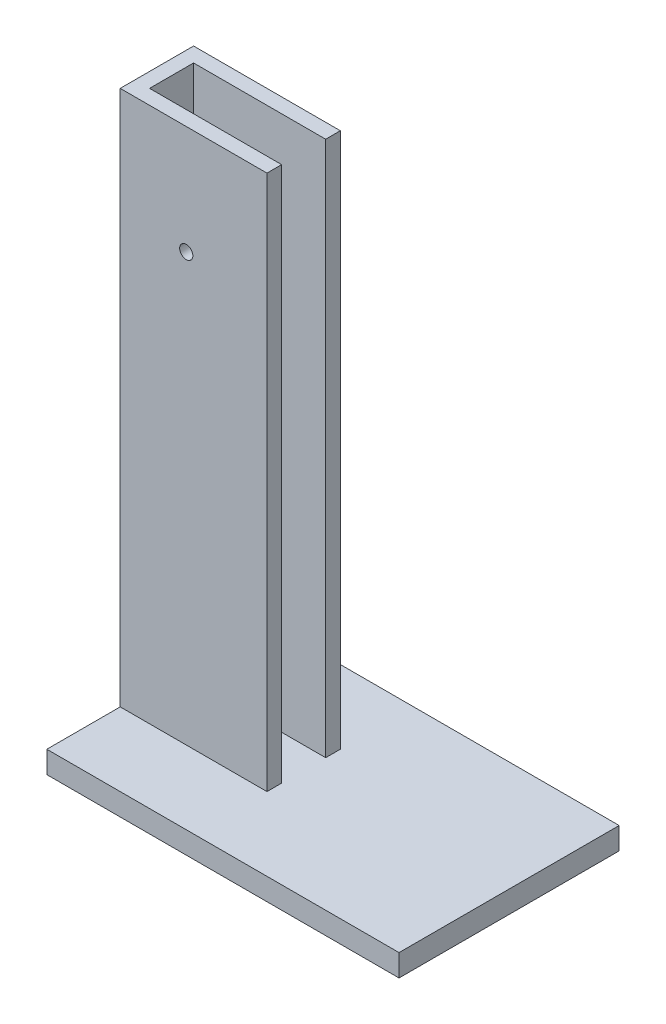
ISO-10303-21;
HEADER;
FILE_DESCRIPTION(('STEP AP214'),'2;1');
FILE_NAME('part.step','',(''),(''),'','','');
FILE_SCHEMA(('AUTOMOTIVE_DESIGN { 1 0 10303 214 1 1 1 1 }'));
ENDSEC;
DATA;
#1=APPLICATION_CONTEXT('core data for automotive mechanical design processes');
#2=APPLICATION_PROTOCOL_DEFINITION('international standard','automotive_design',2000,#1);
#3=PRODUCT_CONTEXT('',#1,'mechanical');
#4=PRODUCT('Part','Part','',(#3));
#5=PRODUCT_RELATED_PRODUCT_CATEGORY('part','',(#4));
#6=PRODUCT_DEFINITION_FORMATION('','',#4);
#7=PRODUCT_DEFINITION_CONTEXT('part definition',#1,'design');
#8=PRODUCT_DEFINITION('design','',#6,#7);
#9=PRODUCT_DEFINITION_SHAPE('','',#8);
#10=(LENGTH_UNIT() NAMED_UNIT(*) SI_UNIT(.MILLI.,.METRE.));
#11=(NAMED_UNIT(*) PLANE_ANGLE_UNIT() SI_UNIT($,.RADIAN.));
#12=(NAMED_UNIT(*) SI_UNIT($,.STERADIAN.) SOLID_ANGLE_UNIT());
#13=UNCERTAINTY_MEASURE_WITH_UNIT(LENGTH_MEASURE(1.E-05),#10,'distance_accuracy_value','');
#14=(GEOMETRIC_REPRESENTATION_CONTEXT(3) GLOBAL_UNCERTAINTY_ASSIGNED_CONTEXT((#13)) GLOBAL_UNIT_ASSIGNED_CONTEXT((#10,
#11,#12)) REPRESENTATION_CONTEXT('',''));
#15=CARTESIAN_POINT('',(0.,0.,0.));
#16=DIRECTION('',(0.,0.,1.));
#17=DIRECTION('',(1.,0.,0.));
#18=AXIS2_PLACEMENT_3D('',#15,#16,#17);
#19=CARTESIAN_POINT('',(380.,-30.,-150.));
#20=DIRECTION('',(-1.,0.,0.));
#21=DIRECTION('',(0.,0.,1.));
#22=AXIS2_PLACEMENT_3D('',#19,#20,#21);
#23=PLANE('',#22);
#24=DIRECTION('',(0.,0.,1.));
#25=VECTOR('',#24,1.);
#26=CARTESIAN_POINT('',(380.,0.,-150.));
#27=LINE('',#26,#25);
#28=CARTESIAN_POINT('',(380.,0.,-150.));
#29=VERTEX_POINT('',#28);
#30=CARTESIAN_POINT('',(380.,0.,150.));
#31=VERTEX_POINT('',#30);
#32=EDGE_CURVE('E120',#29,#31,#27,.T.);
#33=ORIENTED_EDGE('',*,*,#32,.T.);
#34=DIRECTION('',(0.,1.,0.));
#35=VECTOR('',#34,1.);
#36=CARTESIAN_POINT('',(380.,-30.,150.));
#37=LINE('',#36,#35);
#38=CARTESIAN_POINT('',(380.,-30.,150.));
#39=VERTEX_POINT('',#38);
#40=EDGE_CURVE('E12',#39,#31,#37,.T.);
#41=ORIENTED_EDGE('',*,*,#40,.F.);
#42=DIRECTION('',(0.,0.,1.));
#43=VECTOR('',#42,1.);
#44=CARTESIAN_POINT('',(380.,-30.,-150.));
#45=LINE('',#44,#43);
#46=CARTESIAN_POINT('',(380.,-30.,-150.));
#47=VERTEX_POINT('',#46);
#48=EDGE_CURVE('E108',#47,#39,#45,.T.);
#49=ORIENTED_EDGE('',*,*,#48,.F.);
#50=DIRECTION('',(0.,1.,0.));
#51=VECTOR('',#50,1.);
#52=CARTESIAN_POINT('',(380.,-30.,-150.));
#53=LINE('',#52,#51);
#54=EDGE_CURVE('E116',#47,#29,#53,.T.);
#55=ORIENTED_EDGE('',*,*,#54,.T.);
#56=EDGE_LOOP('',(#33,#41,#49,#55));
#57=FACE_BOUND('',#56,.T.);
#58=ADVANCED_FACE('F57',(#57),#23,.F.);
#59=CARTESIAN_POINT('',(-100.,-30.,150.));
#60=DIRECTION('',(0.,0.,-1.));
#61=DIRECTION('',(-1.,0.,0.));
#62=AXIS2_PLACEMENT_3D('',#59,#60,#61);
#63=PLANE('',#62);
#64=DIRECTION('',(-1.,0.,0.));
#65=VECTOR('',#64,1.);
#66=CARTESIAN_POINT('',(-100.,0.,150.));
#67=LINE('',#66,#65);
#68=CARTESIAN_POINT('',(-100.,0.,150.));
#69=VERTEX_POINT('',#68);
#70=EDGE_CURVE('E112',#31,#69,#67,.T.);
#71=ORIENTED_EDGE('',*,*,#70,.T.);
#72=DIRECTION('',(0.,1.,0.));
#73=VECTOR('',#72,1.);
#74=CARTESIAN_POINT('',(-100.,-30.,150.));
#75=LINE('',#74,#73);
#76=CARTESIAN_POINT('',(-100.,-30.,150.));
#77=VERTEX_POINT('',#76);
#78=EDGE_CURVE('E65',#77,#69,#75,.T.);
#79=ORIENTED_EDGE('',*,*,#78,.F.);
#80=DIRECTION('',(-1.,0.,0.));
#81=VECTOR('',#80,1.);
#82=CARTESIAN_POINT('',(-100.,-30.,150.));
#83=LINE('',#82,#81);
#84=EDGE_CURVE('E103',#39,#77,#83,.T.);
#85=ORIENTED_EDGE('',*,*,#84,.F.);
#86=ORIENTED_EDGE('',*,*,#40,.T.);
#87=EDGE_LOOP('',(#71,#79,#85,#86));
#88=FACE_BOUND('',#87,.T.);
#89=ADVANCED_FACE('F111',(#88),#63,.F.);
#90=CARTESIAN_POINT('',(-100.,-30.,-150.));
#91=DIRECTION('',(1.,0.,0.));
#92=DIRECTION('',(0.,0.,-1.));
#93=AXIS2_PLACEMENT_3D('',#90,#91,#92);
#94=PLANE('',#93);
#95=DIRECTION('',(0.,0.,-1.));
#96=VECTOR('',#95,1.);
#97=CARTESIAN_POINT('',(-100.,0.,-150.));
#98=LINE('',#97,#96);
#99=CARTESIAN_POINT('',(-100.,0.,-150.));
#100=VERTEX_POINT('',#99);
#101=EDGE_CURVE('E90',#69,#100,#98,.T.);
#102=ORIENTED_EDGE('',*,*,#101,.T.);
#103=DIRECTION('',(0.,1.,0.));
#104=VECTOR('',#103,1.);
#105=CARTESIAN_POINT('',(-100.,-30.,-150.));
#106=LINE('',#105,#104);
#107=CARTESIAN_POINT('',(-100.,-30.,-150.));
#108=VERTEX_POINT('',#107);
#109=EDGE_CURVE('E113',#108,#100,#106,.T.);
#110=ORIENTED_EDGE('',*,*,#109,.F.);
#111=DIRECTION('',(0.,0.,-1.));
#112=VECTOR('',#111,1.);
#113=CARTESIAN_POINT('',(-100.,-30.,-150.));
#114=LINE('',#113,#112);
#115=EDGE_CURVE('E106',#77,#108,#114,.T.);
#116=ORIENTED_EDGE('',*,*,#115,.F.);
#117=ORIENTED_EDGE('',*,*,#78,.T.);
#118=EDGE_LOOP('',(#102,#110,#116,#117));
#119=FACE_BOUND('',#118,.T.);
#120=ADVANCED_FACE('F114',(#119),#94,.F.);
#121=CARTESIAN_POINT('',(-100.,-30.,-150.));
#122=DIRECTION('',(0.,0.,1.));
#123=DIRECTION('',(1.,0.,0.));
#124=AXIS2_PLACEMENT_3D('',#121,#122,#123);
#125=PLANE('',#124);
#126=DIRECTION('',(1.,0.,0.));
#127=VECTOR('',#126,1.);
#128=CARTESIAN_POINT('',(-100.,0.,-150.));
#129=LINE('',#128,#127);
#130=EDGE_CURVE('E96',#100,#29,#129,.T.);
#131=ORIENTED_EDGE('',*,*,#130,.T.);
#132=ORIENTED_EDGE('',*,*,#54,.F.);
#133=DIRECTION('',(1.,0.,0.));
#134=VECTOR('',#133,1.);
#135=CARTESIAN_POINT('',(-100.,-30.,-150.));
#136=LINE('',#135,#134);
#137=EDGE_CURVE('E73',#108,#47,#136,.T.);
#138=ORIENTED_EDGE('',*,*,#137,.F.);
#139=ORIENTED_EDGE('',*,*,#109,.T.);
#140=EDGE_LOOP('',(#131,#132,#138,#139));
#141=FACE_BOUND('',#140,.T.);
#142=ADVANCED_FACE('F127',(#141),#125,.F.);
#143=CARTESIAN_POINT('',(0.,-30.,0.));
#144=DIRECTION('',(0.,1.,0.));
#145=DIRECTION('',(0.,0.,1.));
#146=AXIS2_PLACEMENT_3D('',#143,#144,#145);
#147=PLANE('',#146);
#148=ORIENTED_EDGE('',*,*,#48,.T.);
#149=ORIENTED_EDGE('',*,*,#84,.T.);
#150=ORIENTED_EDGE('',*,*,#115,.T.);
#151=ORIENTED_EDGE('',*,*,#137,.T.);
#152=EDGE_LOOP('',(#148,#149,#150,#151));
#153=FACE_BOUND('',#152,.T.);
#154=ADVANCED_FACE('F104',(#153),#147,.F.);
#155=CARTESIAN_POINT('',(0.,0.,0.));
#156=DIRECTION('',(0.,1.,0.));
#157=DIRECTION('',(0.,0.,1.));
#158=AXIS2_PLACEMENT_3D('',#155,#156,#157);
#159=PLANE('',#158);
#160=ORIENTED_EDGE('',*,*,#32,.F.);
#161=ORIENTED_EDGE('',*,*,#130,.F.);
#162=ORIENTED_EDGE('',*,*,#101,.F.);
#163=ORIENTED_EDGE('',*,*,#70,.F.);
#164=EDGE_LOOP('',(#160,#161,#162,#163));
#165=FACE_BOUND('',#164,.T.);
#166=ADVANCED_FACE('F130',(#165),#159,.T.);
#167=CLOSED_SHELL('',(#58,#89,#120,#142,#154,#166));
#168=MANIFOLD_SOLID_BREP('B2',#167);
#169=CARTESIAN_POINT('',(100.,730.,-50.));
#170=DIRECTION('',(-1.,0.,0.));
#171=DIRECTION('',(0.,0.,1.));
#172=AXIS2_PLACEMENT_3D('',#169,#170,#171);
#173=PLANE('',#172);
#174=DIRECTION('',(0.,0.,-1.));
#175=VECTOR('',#174,1.);
#176=CARTESIAN_POINT('',(100.,0.,-50.));
#177=LINE('',#176,#175);
#178=CARTESIAN_POINT('',(100.,0.,-30.));
#179=VERTEX_POINT('',#178);
#180=CARTESIAN_POINT('',(100.,0.,-50.));
#181=VERTEX_POINT('',#180);
#182=EDGE_CURVE('E283',#179,#181,#177,.T.);
#183=ORIENTED_EDGE('',*,*,#182,.T.);
#184=DIRECTION('',(0.,-1.,0.));
#185=VECTOR('',#184,1.);
#186=CARTESIAN_POINT('',(100.,730.,-50.));
#187=LINE('',#186,#185);
#188=CARTESIAN_POINT('',(100.,730.,-50.));
#189=VERTEX_POINT('',#188);
#190=EDGE_CURVE('E55',#189,#181,#187,.T.);
#191=ORIENTED_EDGE('',*,*,#190,.F.);
#192=DIRECTION('',(0.,0.,-1.));
#193=VECTOR('',#192,1.);
#194=CARTESIAN_POINT('',(100.,730.,-50.));
#195=LINE('',#194,#193);
#196=CARTESIAN_POINT('',(100.,730.,-30.));
#197=VERTEX_POINT('',#196);
#198=EDGE_CURVE('E306',#197,#189,#195,.T.);
#199=ORIENTED_EDGE('',*,*,#198,.F.);
#200=DIRECTION('',(0.,-1.,0.));
#201=VECTOR('',#200,1.);
#202=CARTESIAN_POINT('',(100.,730.,-30.));
#203=LINE('',#202,#201);
#204=EDGE_CURVE('E279',#197,#179,#203,.T.);
#205=ORIENTED_EDGE('',*,*,#204,.T.);
#206=EDGE_LOOP('',(#183,#191,#199,#205));
#207=FACE_BOUND('',#206,.T.);
#208=ADVANCED_FACE('F181',(#207),#173,.F.);
#209=CARTESIAN_POINT('',(-100.,730.,-50.));
#210=DIRECTION('',(0.,0.,1.));
#211=DIRECTION('',(1.,0.,0.));
#212=AXIS2_PLACEMENT_3D('',#209,#210,#211);
#213=PLANE('',#212);
#214=DIRECTION('',(-1.,0.,0.));
#215=VECTOR('',#214,1.);
#216=CARTESIAN_POINT('',(-100.,0.,-50.));
#217=LINE('',#216,#215);
#218=CARTESIAN_POINT('',(-100.,0.,-50.));
#219=VERTEX_POINT('',#218);
#220=EDGE_CURVE('E287',#181,#219,#217,.T.);
#221=ORIENTED_EDGE('',*,*,#220,.T.);
#222=DIRECTION('',(0.,-1.,0.));
#223=VECTOR('',#222,1.);
#224=CARTESIAN_POINT('',(-100.,730.,-50.));
#225=LINE('',#224,#223);
#226=CARTESIAN_POINT('',(-100.,730.,-50.));
#227=VERTEX_POINT('',#226);
#228=EDGE_CURVE('E191',#227,#219,#225,.T.);
#229=ORIENTED_EDGE('',*,*,#228,.F.);
#230=DIRECTION('',(-1.,0.,0.));
#231=VECTOR('',#230,1.);
#232=CARTESIAN_POINT('',(-100.,730.,-50.));
#233=LINE('',#232,#231);
#234=EDGE_CURVE('E242',#189,#227,#233,.T.);
#235=ORIENTED_EDGE('',*,*,#234,.F.);
#236=ORIENTED_EDGE('',*,*,#190,.T.);
#237=EDGE_LOOP('',(#221,#229,#235,#236));
#238=FACE_BOUND('',#237,.T.);
#239=ADVANCED_FACE('F373',(#238),#213,.F.);
#240=CARTESIAN_POINT('',(-100.,730.,50.));
#241=DIRECTION('',(1.,0.,0.));
#242=DIRECTION('',(0.,0.,-1.));
#243=AXIS2_PLACEMENT_3D('',#240,#241,#242);
#244=PLANE('',#243);
#245=DIRECTION('',(0.,0.,1.));
#246=VECTOR('',#245,1.);
#247=CARTESIAN_POINT('',(-100.,0.,50.));
#248=LINE('',#247,#246);
#249=CARTESIAN_POINT('',(-100.,0.,50.));
#250=VERTEX_POINT('',#249);
#251=EDGE_CURVE('E291',#219,#250,#248,.T.);
#252=ORIENTED_EDGE('',*,*,#251,.T.);
#253=DIRECTION('',(0.,-1.,0.));
#254=VECTOR('',#253,1.);
#255=CARTESIAN_POINT('',(-100.,730.,50.));
#256=LINE('',#255,#254);
#257=CARTESIAN_POINT('',(-100.,730.,50.));
#258=VERTEX_POINT('',#257);
#259=EDGE_CURVE('E317',#258,#250,#256,.T.);
#260=ORIENTED_EDGE('',*,*,#259,.F.);
#261=DIRECTION('',(0.,0.,1.));
#262=VECTOR('',#261,1.);
#263=CARTESIAN_POINT('',(-100.,730.,50.));
#264=LINE('',#263,#262);
#265=EDGE_CURVE('E328',#227,#258,#264,.T.);
#266=ORIENTED_EDGE('',*,*,#265,.F.);
#267=ORIENTED_EDGE('',*,*,#228,.T.);
#268=EDGE_LOOP('',(#252,#260,#266,#267));
#269=FACE_BOUND('',#268,.T.);
#270=ADVANCED_FACE('F326',(#269),#244,.F.);
#271=CARTESIAN_POINT('',(-100.,730.,50.));
#272=DIRECTION('',(0.,0.,-1.));
#273=DIRECTION('',(-1.,0.,0.));
#274=AXIS2_PLACEMENT_3D('',#271,#272,#273);
#275=PLANE('',#274);
#276=CARTESIAN_POINT('',(-10.,581.9,50.));
#277=DIRECTION('',(0.,0.,-1.));
#278=DIRECTION('',(-1.,0.,0.));
#279=AXIS2_PLACEMENT_3D('',#276,#277,#278);
#280=CIRCLE('',#279,9.00000000000002);
#281=CARTESIAN_POINT('',(-0.999999999999994,581.9,50.));
#282=VERTEX_POINT('',#281);
#283=EDGE_CURVE('E288',#282,#282,#280,.F.);
#284=ORIENTED_EDGE('',*,*,#283,.F.);
#285=EDGE_LOOP('',(#284));
#286=FACE_BOUND('',#285,.T.);
#287=DIRECTION('',(1.,0.,0.));
#288=VECTOR('',#287,1.);
#289=CARTESIAN_POINT('',(-100.,0.,50.));
#290=LINE('',#289,#288);
#291=CARTESIAN_POINT('',(100.,0.,50.));
#292=VERTEX_POINT('',#291);
#293=EDGE_CURVE('E294',#250,#292,#290,.T.);
#294=ORIENTED_EDGE('',*,*,#293,.T.);
#295=DIRECTION('',(0.,-1.,0.));
#296=VECTOR('',#295,1.);
#297=CARTESIAN_POINT('',(100.,730.,50.));
#298=LINE('',#297,#296);
#299=CARTESIAN_POINT('',(100.,730.,50.));
#300=VERTEX_POINT('',#299);
#301=EDGE_CURVE('E313',#300,#292,#298,.T.);
#302=ORIENTED_EDGE('',*,*,#301,.F.);
#303=DIRECTION('',(1.,0.,0.));
#304=VECTOR('',#303,1.);
#305=CARTESIAN_POINT('',(-100.,730.,50.));
#306=LINE('',#305,#304);
#307=EDGE_CURVE('E341',#258,#300,#306,.T.);
#308=ORIENTED_EDGE('',*,*,#307,.F.);
#309=ORIENTED_EDGE('',*,*,#259,.T.);
#310=EDGE_LOOP('',(#294,#302,#308,#309));
#311=FACE_BOUND('',#310,.T.);
#312=ADVANCED_FACE('F336',(#286,#311),#275,.F.);
#313=CARTESIAN_POINT('',(100.,730.,50.));
#314=DIRECTION('',(-1.,0.,0.));
#315=DIRECTION('',(0.,0.,1.));
#316=AXIS2_PLACEMENT_3D('',#313,#314,#315);
#317=PLANE('',#316);
#318=DIRECTION('',(0.,0.,-1.));
#319=VECTOR('',#318,1.);
#320=CARTESIAN_POINT('',(100.,0.,50.));
#321=LINE('',#320,#319);
#322=CARTESIAN_POINT('',(100.,0.,30.));
#323=VERTEX_POINT('',#322);
#324=EDGE_CURVE('E297',#292,#323,#321,.T.);
#325=ORIENTED_EDGE('',*,*,#324,.T.);
#326=DIRECTION('',(0.,-1.,0.));
#327=VECTOR('',#326,1.);
#328=CARTESIAN_POINT('',(100.,730.,30.));
#329=LINE('',#328,#327);
#330=CARTESIAN_POINT('',(100.,730.,30.));
#331=VERTEX_POINT('',#330);
#332=EDGE_CURVE('E272',#331,#323,#329,.T.);
#333=ORIENTED_EDGE('',*,*,#332,.F.);
#334=DIRECTION('',(0.,0.,-1.));
#335=VECTOR('',#334,1.);
#336=CARTESIAN_POINT('',(100.,730.,50.));
#337=LINE('',#336,#335);
#338=EDGE_CURVE('E261',#300,#331,#337,.T.);
#339=ORIENTED_EDGE('',*,*,#338,.F.);
#340=ORIENTED_EDGE('',*,*,#301,.T.);
#341=EDGE_LOOP('',(#325,#333,#339,#340));
#342=FACE_BOUND('',#341,.T.);
#343=ADVANCED_FACE('F339',(#342),#317,.F.);
#344=CARTESIAN_POINT('',(-80.,730.,30.));
#345=DIRECTION('',(0.,0.,1.));
#346=DIRECTION('',(1.,0.,0.));
#347=AXIS2_PLACEMENT_3D('',#344,#345,#346);
#348=PLANE('',#347);
#349=CARTESIAN_POINT('',(-10.,581.9,30.));
#350=DIRECTION('',(0.,0.,1.));
#351=DIRECTION('',(1.,0.,0.));
#352=AXIS2_PLACEMENT_3D('',#349,#350,#351);
#353=CIRCLE('',#352,9.00000000000002);
#354=CARTESIAN_POINT('',(-0.999999999999994,581.9,30.));
#355=VERTEX_POINT('',#354);
#356=EDGE_CURVE('E184',#355,#355,#353,.F.);
#357=ORIENTED_EDGE('',*,*,#356,.F.);
#358=EDGE_LOOP('',(#357));
#359=FACE_BOUND('',#358,.T.);
#360=DIRECTION('',(-1.,0.,0.));
#361=VECTOR('',#360,1.);
#362=CARTESIAN_POINT('',(-80.,0.,30.));
#363=LINE('',#362,#361);
#364=CARTESIAN_POINT('',(-80.,0.,30.));
#365=VERTEX_POINT('',#364);
#366=EDGE_CURVE('E270',#323,#365,#363,.T.);
#367=ORIENTED_EDGE('',*,*,#366,.T.);
#368=DIRECTION('',(0.,-1.,0.));
#369=VECTOR('',#368,1.);
#370=CARTESIAN_POINT('',(-80.,730.,30.));
#371=LINE('',#370,#369);
#372=CARTESIAN_POINT('',(-80.,730.,30.));
#373=VERTEX_POINT('',#372);
#374=EDGE_CURVE('E267',#373,#365,#371,.T.);
#375=ORIENTED_EDGE('',*,*,#374,.F.);
#376=DIRECTION('',(-1.,0.,0.));
#377=VECTOR('',#376,1.);
#378=CARTESIAN_POINT('',(-80.,730.,30.));
#379=LINE('',#378,#377);
#380=EDGE_CURVE('E255',#331,#373,#379,.T.);
#381=ORIENTED_EDGE('',*,*,#380,.F.);
#382=ORIENTED_EDGE('',*,*,#332,.T.);
#383=EDGE_LOOP('',(#367,#375,#381,#382));
#384=FACE_BOUND('',#383,.T.);
#385=ADVANCED_FACE('F268',(#359,#384),#348,.F.);
#386=CARTESIAN_POINT('',(-80.,730.,30.));
#387=DIRECTION('',(-1.,0.,0.));
#388=DIRECTION('',(0.,0.,1.));
#389=AXIS2_PLACEMENT_3D('',#386,#387,#388);
#390=PLANE('',#389);
#391=DIRECTION('',(0.,0.,-1.));
#392=VECTOR('',#391,1.);
#393=CARTESIAN_POINT('',(-80.,0.,30.));
#394=LINE('',#393,#392);
#395=CARTESIAN_POINT('',(-80.,0.,-30.));
#396=VERTEX_POINT('',#395);
#397=EDGE_CURVE('E228',#365,#396,#394,.T.);
#398=ORIENTED_EDGE('',*,*,#397,.T.);
#399=DIRECTION('',(0.,-1.,0.));
#400=VECTOR('',#399,1.);
#401=CARTESIAN_POINT('',(-80.,730.,-30.));
#402=LINE('',#401,#400);
#403=CARTESIAN_POINT('',(-80.,730.,-30.));
#404=VERTEX_POINT('',#403);
#405=EDGE_CURVE('E273',#404,#396,#402,.T.);
#406=ORIENTED_EDGE('',*,*,#405,.F.);
#407=DIRECTION('',(0.,0.,-1.));
#408=VECTOR('',#407,1.);
#409=CARTESIAN_POINT('',(-80.,730.,30.));
#410=LINE('',#409,#408);
#411=EDGE_CURVE('E259',#373,#404,#410,.T.);
#412=ORIENTED_EDGE('',*,*,#411,.F.);
#413=ORIENTED_EDGE('',*,*,#374,.T.);
#414=EDGE_LOOP('',(#398,#406,#412,#413));
#415=FACE_BOUND('',#414,.T.);
#416=ADVANCED_FACE('F275',(#415),#390,.F.);
#417=CARTESIAN_POINT('',(-80.,730.,-30.));
#418=DIRECTION('',(0.,0.,-1.));
#419=DIRECTION('',(-1.,0.,0.));
#420=AXIS2_PLACEMENT_3D('',#417,#418,#419);
#421=PLANE('',#420);
#422=DIRECTION('',(1.,0.,0.));
#423=VECTOR('',#422,1.);
#424=CARTESIAN_POINT('',(-80.,0.,-30.));
#425=LINE('',#424,#423);
#426=EDGE_CURVE('E234',#396,#179,#425,.T.);
#427=ORIENTED_EDGE('',*,*,#426,.T.);
#428=ORIENTED_EDGE('',*,*,#204,.F.);
#429=DIRECTION('',(1.,0.,0.));
#430=VECTOR('',#429,1.);
#431=CARTESIAN_POINT('',(-80.,730.,-30.));
#432=LINE('',#431,#430);
#433=EDGE_CURVE('E199',#404,#197,#432,.T.);
#434=ORIENTED_EDGE('',*,*,#433,.F.);
#435=ORIENTED_EDGE('',*,*,#405,.T.);
#436=EDGE_LOOP('',(#427,#428,#434,#435));
#437=FACE_BOUND('',#436,.T.);
#438=ADVANCED_FACE('F368',(#437),#421,.F.);
#439=CARTESIAN_POINT('',(0.,730.,0.));
#440=DIRECTION('',(0.,1.,0.));
#441=DIRECTION('',(0.,0.,1.));
#442=AXIS2_PLACEMENT_3D('',#439,#440,#441);
#443=PLANE('',#442);
#444=ORIENTED_EDGE('',*,*,#198,.T.);
#445=ORIENTED_EDGE('',*,*,#234,.T.);
#446=ORIENTED_EDGE('',*,*,#265,.T.);
#447=ORIENTED_EDGE('',*,*,#307,.T.);
#448=ORIENTED_EDGE('',*,*,#338,.T.);
#449=ORIENTED_EDGE('',*,*,#380,.T.);
#450=ORIENTED_EDGE('',*,*,#411,.T.);
#451=ORIENTED_EDGE('',*,*,#433,.T.);
#452=EDGE_LOOP('',(#444,#445,#446,#447,#448,#449,#450,#451));
#453=FACE_BOUND('',#452,.T.);
#454=ADVANCED_FACE('F257',(#453),#443,.T.);
#455=CARTESIAN_POINT('',(0.,0.,0.));
#456=DIRECTION('',(0.,1.,0.));
#457=DIRECTION('',(0.,0.,1.));
#458=AXIS2_PLACEMENT_3D('',#455,#456,#457);
#459=PLANE('',#458);
#460=ORIENTED_EDGE('',*,*,#182,.F.);
#461=ORIENTED_EDGE('',*,*,#426,.F.);
#462=ORIENTED_EDGE('',*,*,#397,.F.);
#463=ORIENTED_EDGE('',*,*,#366,.F.);
#464=ORIENTED_EDGE('',*,*,#324,.F.);
#465=ORIENTED_EDGE('',*,*,#293,.F.);
#466=ORIENTED_EDGE('',*,*,#251,.F.);
#467=ORIENTED_EDGE('',*,*,#220,.F.);
#468=EDGE_LOOP('',(#460,#461,#462,#463,#464,#465,#466,#467));
#469=FACE_BOUND('',#468,.T.);
#470=ADVANCED_FACE('F332',(#469),#459,.F.);
#471=CARTESIAN_POINT('',(-10.,581.9,0.99999999999998));
#472=DIRECTION('',(0.,0.,1.));
#473=DIRECTION('',(1.,0.,0.));
#474=AXIS2_PLACEMENT_3D('',#471,#472,#473);
#475=CYLINDRICAL_SURFACE('',#474,9.00000000000002);
#476=CARTESIAN_POINT('',(-0.999999999999994,581.9,30.));
#477=CARTESIAN_POINT('',(-0.999999999999994,581.9,30.2083333333333));
#478=CARTESIAN_POINT('',(-0.999999999999994,581.9,30.4166666666667));
#479=CARTESIAN_POINT('',(-0.999999999999994,581.9,30.8333333333333));
#480=CARTESIAN_POINT('',(-0.999999999999994,581.9,31.0416666666667));
#481=CARTESIAN_POINT('',(-0.999999999999994,581.9,31.4583333333333));
#482=CARTESIAN_POINT('',(-0.999999999999994,581.9,31.6666666666667));
#483=CARTESIAN_POINT('',(-0.999999999999994,581.9,32.0833333333333));
#484=CARTESIAN_POINT('',(-0.999999999999994,581.9,32.2916666666667));
#485=CARTESIAN_POINT('',(-0.999999999999994,581.9,32.7083333333333));
#486=CARTESIAN_POINT('',(-0.999999999999994,581.9,32.9166666666667));
#487=CARTESIAN_POINT('',(-0.999999999999994,581.9,33.3333333333333));
#488=CARTESIAN_POINT('',(-0.999999999999994,581.9,33.5416666666667));
#489=CARTESIAN_POINT('',(-0.999999999999994,581.9,33.9583333333333));
#490=CARTESIAN_POINT('',(-0.999999999999994,581.9,34.1666666666667));
#491=CARTESIAN_POINT('',(-0.999999999999994,581.9,34.5833333333333));
#492=CARTESIAN_POINT('',(-0.999999999999994,581.9,34.7916666666667));
#493=CARTESIAN_POINT('',(-0.999999999999994,581.9,35.2083333333333));
#494=CARTESIAN_POINT('',(-0.999999999999994,581.9,35.4166666666667));
#495=CARTESIAN_POINT('',(-0.999999999999994,581.9,35.8333333333333));
#496=CARTESIAN_POINT('',(-0.999999999999994,581.9,36.0416666666667));
#497=CARTESIAN_POINT('',(-0.999999999999994,581.9,36.4583333333333));
#498=CARTESIAN_POINT('',(-0.999999999999994,581.9,36.6666666666667));
#499=CARTESIAN_POINT('',(-0.999999999999994,581.9,37.0833333333333));
#500=CARTESIAN_POINT('',(-0.999999999999994,581.9,37.2916666666667));
#501=CARTESIAN_POINT('',(-0.999999999999994,581.9,37.7083333333333));
#502=CARTESIAN_POINT('',(-0.999999999999994,581.9,37.9166666666667));
#503=CARTESIAN_POINT('',(-0.999999999999994,581.9,38.3333333333333));
#504=CARTESIAN_POINT('',(-0.999999999999994,581.9,38.5416666666667));
#505=CARTESIAN_POINT('',(-0.999999999999994,581.9,38.9583333333333));
#506=CARTESIAN_POINT('',(-0.999999999999994,581.9,39.1666666666667));
#507=CARTESIAN_POINT('',(-0.999999999999994,581.9,39.5833333333333));
#508=CARTESIAN_POINT('',(-0.999999999999994,581.9,39.7916666666667));
#509=CARTESIAN_POINT('',(-0.999999999999994,581.9,40.2083333333333));
#510=CARTESIAN_POINT('',(-0.999999999999994,581.9,40.4166666666667));
#511=CARTESIAN_POINT('',(-0.999999999999994,581.9,40.8333333333333));
#512=CARTESIAN_POINT('',(-0.999999999999994,581.9,41.0416666666667));
#513=CARTESIAN_POINT('',(-0.999999999999994,581.9,41.4583333333333));
#514=CARTESIAN_POINT('',(-0.999999999999994,581.9,41.6666666666667));
#515=CARTESIAN_POINT('',(-0.999999999999994,581.9,42.0833333333333));
#516=CARTESIAN_POINT('',(-0.999999999999994,581.9,42.2916666666667));
#517=CARTESIAN_POINT('',(-0.999999999999994,581.9,42.7083333333333));
#518=CARTESIAN_POINT('',(-0.999999999999994,581.9,42.9166666666667));
#519=CARTESIAN_POINT('',(-0.999999999999994,581.9,43.3333333333333));
#520=CARTESIAN_POINT('',(-0.999999999999994,581.9,43.5416666666667));
#521=CARTESIAN_POINT('',(-0.999999999999994,581.9,43.9583333333333));
#522=CARTESIAN_POINT('',(-0.999999999999994,581.9,44.1666666666667));
#523=CARTESIAN_POINT('',(-0.999999999999994,581.9,44.5833333333333));
#524=CARTESIAN_POINT('',(-0.999999999999994,581.9,44.7916666666667));
#525=CARTESIAN_POINT('',(-0.999999999999994,581.9,45.2083333333333));
#526=CARTESIAN_POINT('',(-0.999999999999994,581.9,45.4166666666667));
#527=CARTESIAN_POINT('',(-0.999999999999994,581.9,45.8333333333333));
#528=CARTESIAN_POINT('',(-0.999999999999994,581.9,46.0416666666667));
#529=CARTESIAN_POINT('',(-0.999999999999994,581.9,46.4583333333333));
#530=CARTESIAN_POINT('',(-0.999999999999994,581.9,46.6666666666667));
#531=CARTESIAN_POINT('',(-0.999999999999994,581.9,47.0833333333333));
#532=CARTESIAN_POINT('',(-0.999999999999994,581.9,47.2916666666667));
#533=CARTESIAN_POINT('',(-0.999999999999994,581.9,47.7083333333333));
#534=CARTESIAN_POINT('',(-0.999999999999994,581.9,47.9166666666667));
#535=CARTESIAN_POINT('',(-0.999999999999994,581.9,48.3333333333333));
#536=CARTESIAN_POINT('',(-0.999999999999994,581.9,48.5416666666667));
#537=CARTESIAN_POINT('',(-0.999999999999994,581.9,48.9583333333333));
#538=CARTESIAN_POINT('',(-0.999999999999994,581.9,49.1666666666667));
#539=CARTESIAN_POINT('',(-0.999999999999994,581.9,49.5833333333333));
#540=CARTESIAN_POINT('',(-0.999999999999994,581.9,49.7916666666667));
#541=CARTESIAN_POINT('',(-0.999999999999994,581.9,50.));
#542=B_SPLINE_CURVE_WITH_KNOTS('',3,(#476,#477,#478,#479,#480,#481,#482,#483,#484,#485,#486,
#487,#488,#489,#490,#491,#492,#493,#494,#495,#496,#497,#498,#499,#500,#501,#502,#503,#504,#505,
#506,#507,#508,#509,#510,#511,#512,#513,#514,#515,#516,#517,#518,#519,#520,#521,#522,#523,#524,
#525,#526,#527,#528,#529,#530,#531,#532,#533,#534,#535,#536,#537,#538,#539,#540,#541),
.UNSPECIFIED.,.F.,.F.,(4,2,2,2,2,2,2,2,2,2,2,2,2,2,2,2,2,2,2,2,2,2,2,2,2,2,2,2,2,2,2,2,4),(0.,
0.625000000000001,1.25,1.87500000000001,2.5,3.125,3.75,4.375,5.,5.625,6.25,6.875,7.5,8.125,8.75,
9.375,10.,10.625,11.25,11.875,12.5,13.125,13.75,14.375,15.,15.625,16.25,16.875,17.5,18.125,
18.75,19.375,20.),.UNSPECIFIED.);
#543=EDGE_CURVE('BSEAM359',#355,#282,#542,.T.);
#544=ORIENTED_EDGE('',*,*,#356,.T.);
#545=ORIENTED_EDGE('',*,*,#283,.T.);
#546=ORIENTED_EDGE('',*,*,#543,.T.);
#547=ORIENTED_EDGE('',*,*,#543,.F.);
#548=EDGE_LOOP('',(#544,#546,#545,#547));
#549=FACE_BOUND('',#548,.T.);
#550=ADVANCED_FACE('F359',(#549),#475,.F.);
#551=CLOSED_SHELL('',(#208,#239,#270,#312,#343,#385,#416,#438,#454,#470,#550));
#552=MANIFOLD_SOLID_BREP('B6',#551);
#553=ADVANCED_BREP_SHAPE_REPRESENTATION('',(#18,#168,#552),#14);
#554=SHAPE_DEFINITION_REPRESENTATION(#9,#553);
ENDSEC;
END-ISO-10303-21;
